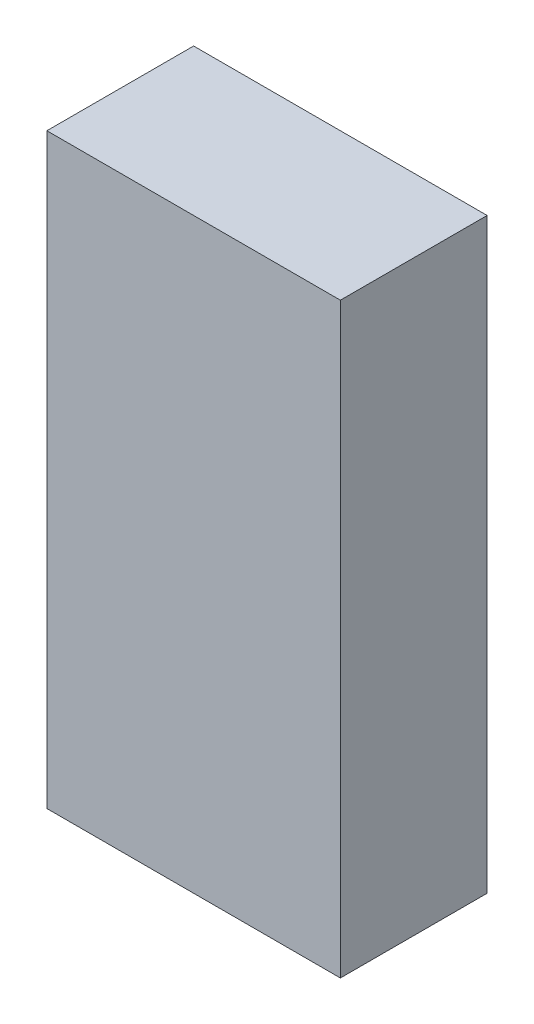
ISO-10303-21;
HEADER;
FILE_DESCRIPTION(('STEP AP214'),'2;1');
FILE_NAME('part.step','',(''),(''),'','','');
FILE_SCHEMA(('AUTOMOTIVE_DESIGN { 1 0 10303 214 1 1 1 1 }'));
ENDSEC;
DATA;
#1=APPLICATION_CONTEXT('core data for automotive mechanical design processes');
#2=APPLICATION_PROTOCOL_DEFINITION('international standard','automotive_design',2000,#1);
#3=PRODUCT_CONTEXT('',#1,'mechanical');
#4=PRODUCT('Part','Part','',(#3));
#5=PRODUCT_RELATED_PRODUCT_CATEGORY('part','',(#4));
#6=PRODUCT_DEFINITION_FORMATION('','',#4);
#7=PRODUCT_DEFINITION_CONTEXT('part definition',#1,'design');
#8=PRODUCT_DEFINITION('design','',#6,#7);
#9=PRODUCT_DEFINITION_SHAPE('','',#8);
#10=(LENGTH_UNIT() NAMED_UNIT(*) SI_UNIT(.MILLI.,.METRE.));
#11=(NAMED_UNIT(*) PLANE_ANGLE_UNIT() SI_UNIT($,.RADIAN.));
#12=(NAMED_UNIT(*) SI_UNIT($,.STERADIAN.) SOLID_ANGLE_UNIT());
#13=UNCERTAINTY_MEASURE_WITH_UNIT(LENGTH_MEASURE(1.E-05),#10,'distance_accuracy_value','');
#14=(GEOMETRIC_REPRESENTATION_CONTEXT(3) GLOBAL_UNCERTAINTY_ASSIGNED_CONTEXT((#13)) GLOBAL_UNIT_ASSIGNED_CONTEXT((#10,
#11,#12)) REPRESENTATION_CONTEXT('',''));
#15=CARTESIAN_POINT('',(0.,0.,0.));
#16=DIRECTION('',(0.,0.,1.));
#17=DIRECTION('',(1.,0.,0.));
#18=AXIS2_PLACEMENT_3D('',#15,#16,#17);
#19=CARTESIAN_POINT('',(-15.,-30.,7.5));
#20=DIRECTION('',(1.,0.,0.));
#21=DIRECTION('',(0.,0.,-1.));
#22=AXIS2_PLACEMENT_3D('',#19,#20,#21);
#23=PLANE('',#22);
#24=DIRECTION('',(0.,-1.,0.));
#25=VECTOR('',#24,1.);
#26=CARTESIAN_POINT('',(-15.,-30.,-7.5));
#27=LINE('',#26,#25);
#28=CARTESIAN_POINT('',(-15.,30.,-7.5));
#29=VERTEX_POINT('',#28);
#30=CARTESIAN_POINT('',(-15.,-30.,-7.5));
#31=VERTEX_POINT('',#30);
#32=EDGE_CURVE('E101',#29,#31,#27,.T.);
#33=ORIENTED_EDGE('',*,*,#32,.T.);
#34=DIRECTION('',(0.,0.,-1.));
#35=VECTOR('',#34,1.);
#36=CARTESIAN_POINT('',(-15.,-30.,7.5));
#37=LINE('',#36,#35);
#38=CARTESIAN_POINT('',(-15.,-30.,7.5));
#39=VERTEX_POINT('',#38);
#40=EDGE_CURVE('E11',#39,#31,#37,.T.);
#41=ORIENTED_EDGE('',*,*,#40,.F.);
#42=DIRECTION('',(0.,-1.,0.));
#43=VECTOR('',#42,1.);
#44=CARTESIAN_POINT('',(-15.,-30.,7.5));
#45=LINE('',#44,#43);
#46=CARTESIAN_POINT('',(-15.,30.,7.5));
#47=VERTEX_POINT('',#46);
#48=EDGE_CURVE('E89',#47,#39,#45,.T.);
#49=ORIENTED_EDGE('',*,*,#48,.F.);
#50=DIRECTION('',(0.,0.,-1.));
#51=VECTOR('',#50,1.);
#52=CARTESIAN_POINT('',(-15.,30.,7.5));
#53=LINE('',#52,#51);
#54=EDGE_CURVE('E97',#47,#29,#53,.T.);
#55=ORIENTED_EDGE('',*,*,#54,.T.);
#56=EDGE_LOOP('',(#33,#41,#49,#55));
#57=FACE_BOUND('',#56,.T.);
#58=ADVANCED_FACE('F38',(#57),#23,.F.);
#59=CARTESIAN_POINT('',(15.,-30.,7.5));
#60=DIRECTION('',(0.,1.,0.));
#61=DIRECTION('',(-1.,0.,0.));
#62=AXIS2_PLACEMENT_3D('',#59,#60,#61);
#63=PLANE('',#62);
#64=DIRECTION('',(1.,0.,0.));
#65=VECTOR('',#64,1.);
#66=CARTESIAN_POINT('',(15.,-30.,-7.5));
#67=LINE('',#66,#65);
#68=CARTESIAN_POINT('',(15.,-30.,-7.5));
#69=VERTEX_POINT('',#68);
#70=EDGE_CURVE('E93',#31,#69,#67,.T.);
#71=ORIENTED_EDGE('',*,*,#70,.T.);
#72=DIRECTION('',(0.,0.,-1.));
#73=VECTOR('',#72,1.);
#74=CARTESIAN_POINT('',(15.,-30.,7.5));
#75=LINE('',#74,#73);
#76=CARTESIAN_POINT('',(15.,-30.,7.5));
#77=VERTEX_POINT('',#76);
#78=EDGE_CURVE('E46',#77,#69,#75,.T.);
#79=ORIENTED_EDGE('',*,*,#78,.F.);
#80=DIRECTION('',(1.,0.,0.));
#81=VECTOR('',#80,1.);
#82=CARTESIAN_POINT('',(15.,-30.,7.5));
#83=LINE('',#82,#81);
#84=EDGE_CURVE('E84',#39,#77,#83,.T.);
#85=ORIENTED_EDGE('',*,*,#84,.F.);
#86=ORIENTED_EDGE('',*,*,#40,.T.);
#87=EDGE_LOOP('',(#71,#79,#85,#86));
#88=FACE_BOUND('',#87,.T.);
#89=ADVANCED_FACE('F92',(#88),#63,.F.);
#90=CARTESIAN_POINT('',(15.,-30.,7.5));
#91=DIRECTION('',(-1.,0.,0.));
#92=DIRECTION('',(0.,0.,1.));
#93=AXIS2_PLACEMENT_3D('',#90,#91,#92);
#94=PLANE('',#93);
#95=DIRECTION('',(0.,1.,0.));
#96=VECTOR('',#95,1.);
#97=CARTESIAN_POINT('',(15.,-30.,-7.5));
#98=LINE('',#97,#96);
#99=CARTESIAN_POINT('',(15.,30.,-7.5));
#100=VERTEX_POINT('',#99);
#101=EDGE_CURVE('E71',#69,#100,#98,.T.);
#102=ORIENTED_EDGE('',*,*,#101,.T.);
#103=DIRECTION('',(0.,0.,-1.));
#104=VECTOR('',#103,1.);
#105=CARTESIAN_POINT('',(15.,30.,7.5));
#106=LINE('',#105,#104);
#107=CARTESIAN_POINT('',(15.,30.,7.5));
#108=VERTEX_POINT('',#107);
#109=EDGE_CURVE('E94',#108,#100,#106,.T.);
#110=ORIENTED_EDGE('',*,*,#109,.F.);
#111=DIRECTION('',(0.,1.,0.));
#112=VECTOR('',#111,1.);
#113=CARTESIAN_POINT('',(15.,-30.,7.5));
#114=LINE('',#113,#112);
#115=EDGE_CURVE('E87',#77,#108,#114,.T.);
#116=ORIENTED_EDGE('',*,*,#115,.F.);
#117=ORIENTED_EDGE('',*,*,#78,.T.);
#118=EDGE_LOOP('',(#102,#110,#116,#117));
#119=FACE_BOUND('',#118,.T.);
#120=ADVANCED_FACE('F95',(#119),#94,.F.);
#121=CARTESIAN_POINT('',(15.,30.,7.5));
#122=DIRECTION('',(0.,-1.,0.));
#123=DIRECTION('',(1.,0.,0.));
#124=AXIS2_PLACEMENT_3D('',#121,#122,#123);
#125=PLANE('',#124);
#126=DIRECTION('',(-1.,0.,0.));
#127=VECTOR('',#126,1.);
#128=CARTESIAN_POINT('',(15.,30.,-7.5));
#129=LINE('',#128,#127);
#130=EDGE_CURVE('E77',#100,#29,#129,.T.);
#131=ORIENTED_EDGE('',*,*,#130,.T.);
#132=ORIENTED_EDGE('',*,*,#54,.F.);
#133=DIRECTION('',(-1.,0.,0.));
#134=VECTOR('',#133,1.);
#135=CARTESIAN_POINT('',(15.,30.,7.5));
#136=LINE('',#135,#134);
#137=EDGE_CURVE('E54',#108,#47,#136,.T.);
#138=ORIENTED_EDGE('',*,*,#137,.F.);
#139=ORIENTED_EDGE('',*,*,#109,.T.);
#140=EDGE_LOOP('',(#131,#132,#138,#139));
#141=FACE_BOUND('',#140,.T.);
#142=ADVANCED_FACE('F108',(#141),#125,.F.);
#143=CARTESIAN_POINT('',(0.,0.,7.5));
#144=DIRECTION('',(0.,0.,1.));
#145=DIRECTION('',(1.,0.,0.));
#146=AXIS2_PLACEMENT_3D('',#143,#144,#145);
#147=PLANE('',#146);
#148=ORIENTED_EDGE('',*,*,#48,.T.);
#149=ORIENTED_EDGE('',*,*,#84,.T.);
#150=ORIENTED_EDGE('',*,*,#115,.T.);
#151=ORIENTED_EDGE('',*,*,#137,.T.);
#152=EDGE_LOOP('',(#148,#149,#150,#151));
#153=FACE_BOUND('',#152,.T.);
#154=ADVANCED_FACE('F85',(#153),#147,.T.);
#155=CARTESIAN_POINT('',(0.,0.,-7.5));
#156=DIRECTION('',(0.,0.,1.));
#157=DIRECTION('',(1.,0.,0.));
#158=AXIS2_PLACEMENT_3D('',#155,#156,#157);
#159=PLANE('',#158);
#160=ORIENTED_EDGE('',*,*,#32,.F.);
#161=ORIENTED_EDGE('',*,*,#130,.F.);
#162=ORIENTED_EDGE('',*,*,#101,.F.);
#163=ORIENTED_EDGE('',*,*,#70,.F.);
#164=EDGE_LOOP('',(#160,#161,#162,#163));
#165=FACE_BOUND('',#164,.T.);
#166=ADVANCED_FACE('F111',(#165),#159,.F.);
#167=CLOSED_SHELL('',(#58,#89,#120,#142,#154,#166));
#168=MANIFOLD_SOLID_BREP('B2',#167);
#169=ADVANCED_BREP_SHAPE_REPRESENTATION('',(#18,#168),#14);
#170=SHAPE_DEFINITION_REPRESENTATION(#9,#169);
ENDSEC;
END-ISO-10303-21;
